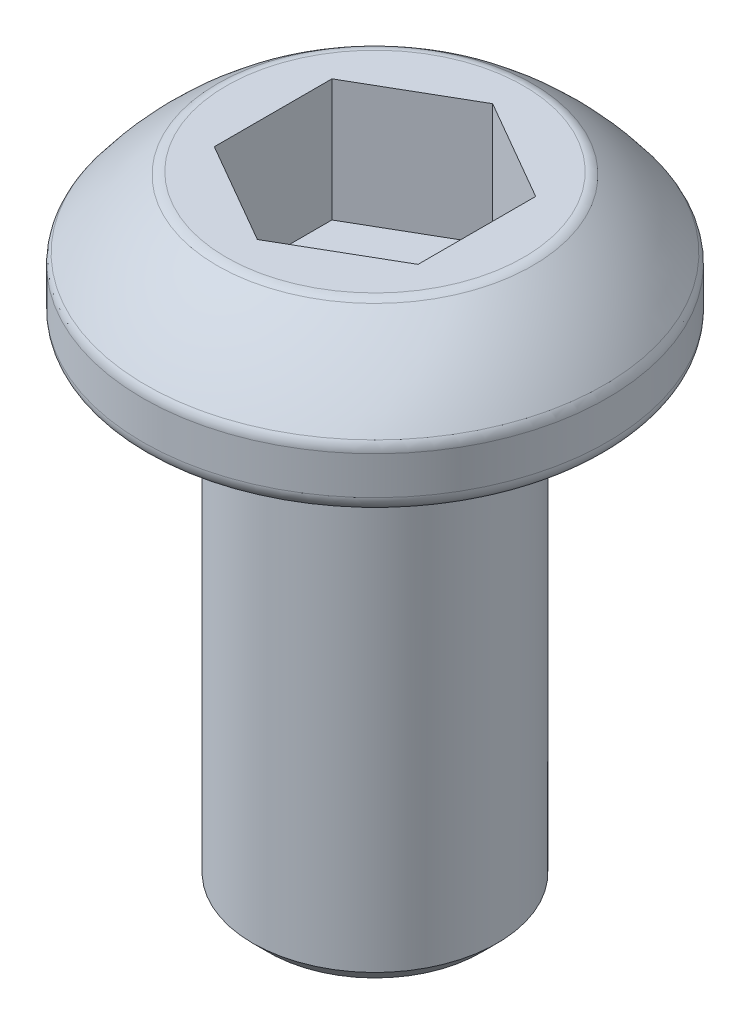
ISO-10303-21;
HEADER;
FILE_DESCRIPTION(('STEP AP214'),'2;1');
FILE_NAME('part.step','',(''),(''),'','','');
FILE_SCHEMA(('AUTOMOTIVE_DESIGN { 1 0 10303 214 1 1 1 1 }'));
ENDSEC;
DATA;
#1=APPLICATION_CONTEXT('core data for automotive mechanical design processes');
#2=APPLICATION_PROTOCOL_DEFINITION('international standard','automotive_design',2000,#1);
#3=PRODUCT_CONTEXT('',#1,'mechanical');
#4=PRODUCT('Part','Part','',(#3));
#5=PRODUCT_RELATED_PRODUCT_CATEGORY('part','',(#4));
#6=PRODUCT_DEFINITION_FORMATION('','',#4);
#7=PRODUCT_DEFINITION_CONTEXT('part definition',#1,'design');
#8=PRODUCT_DEFINITION('design','',#6,#7);
#9=PRODUCT_DEFINITION_SHAPE('','',#8);
#10=(LENGTH_UNIT() NAMED_UNIT(*) SI_UNIT(.MILLI.,.METRE.));
#11=(NAMED_UNIT(*) PLANE_ANGLE_UNIT() SI_UNIT($,.RADIAN.));
#12=(NAMED_UNIT(*) SI_UNIT($,.STERADIAN.) SOLID_ANGLE_UNIT());
#13=UNCERTAINTY_MEASURE_WITH_UNIT(LENGTH_MEASURE(1.E-05),#10,'distance_accuracy_value','');
#14=(GEOMETRIC_REPRESENTATION_CONTEXT(3) GLOBAL_UNCERTAINTY_ASSIGNED_CONTEXT((#13)) GLOBAL_UNIT_ASSIGNED_CONTEXT((#10,
#11,#12)) REPRESENTATION_CONTEXT('',''));
#15=CARTESIAN_POINT('',(0.,0.,0.));
#16=DIRECTION('',(0.,0.,1.));
#17=DIRECTION('',(1.,0.,0.));
#18=AXIS2_PLACEMENT_3D('',#15,#16,#17);
#19=CARTESIAN_POINT('',(0.,60.1595545799248,0.));
#20=DIRECTION('',(0.,1.,0.));
#21=DIRECTION('',(0.,0.,1.));
#22=AXIS2_PLACEMENT_3D('',#19,#20,#21);
#23=CYLINDRICAL_SURFACE('',#22,2.85);
#24=CARTESIAN_POINT('',(0.,0.666596043929719,0.));
#25=DIRECTION('',(0.,-1.,0.));
#26=DIRECTION('',(0.,0.,-1.));
#27=AXIS2_PLACEMENT_3D('',#24,#25,#26);
#28=CIRCLE('',#27,2.85);
#29=CARTESIAN_POINT('',(0.,0.666596043929719,-2.85));
#30=VERTEX_POINT('',#29);
#31=EDGE_CURVE('E11',#30,#30,#28,.T.);
#32=ORIENTED_EDGE('',*,*,#31,.T.);
#33=EDGE_LOOP('',(#32));
#34=FACE_BOUND('',#33,.T.);
#35=CARTESIAN_POINT('',(0.,0.2,0.));
#36=DIRECTION('',(0.,-1.,0.));
#37=DIRECTION('',(0.,0.,-1.));
#38=AXIS2_PLACEMENT_3D('',#35,#36,#37);
#39=CIRCLE('',#38,2.85);
#40=CARTESIAN_POINT('',(0.,0.2,-2.85));
#41=VERTEX_POINT('',#40);
#42=EDGE_CURVE('E127',#41,#41,#39,.F.);
#43=ORIENTED_EDGE('',*,*,#42,.T.);
#44=EDGE_LOOP('',(#43));
#45=FACE_BOUND('',#44,.T.);
#46=ADVANCED_FACE('F17',(#34,#45),#23,.T.);
#47=CARTESIAN_POINT('',(-1.5,0.,0.));
#48=DIRECTION('',(0.,-1.,0.));
#49=DIRECTION('',(0.,0.,-1.));
#50=AXIS2_PLACEMENT_3D('',#47,#48,#49);
#51=PLANE('',#50);
#52=CARTESIAN_POINT('',(0.,0.,0.));
#53=DIRECTION('',(0.,-1.,0.));
#54=DIRECTION('',(0.,0.,-1.));
#55=AXIS2_PLACEMENT_3D('',#52,#53,#54);
#56=CIRCLE('',#55,2.65);
#57=CARTESIAN_POINT('',(0.,0.,-2.65));
#58=VERTEX_POINT('',#57);
#59=EDGE_CURVE('E130',#58,#58,#56,.T.);
#60=ORIENTED_EDGE('',*,*,#59,.T.);
#61=EDGE_LOOP('',(#60));
#62=FACE_BOUND('',#61,.T.);
#63=CARTESIAN_POINT('',(0.,0.,0.));
#64=DIRECTION('',(0.,1.,0.));
#65=DIRECTION('',(0.,0.,1.));
#66=AXIS2_PLACEMENT_3D('',#63,#64,#65);
#67=CIRCLE('',#66,1.5);
#68=CARTESIAN_POINT('',(0.,0.,1.5));
#69=VERTEX_POINT('',#68);
#70=EDGE_CURVE('E119',#69,#69,#67,.T.);
#71=ORIENTED_EDGE('',*,*,#70,.T.);
#72=EDGE_LOOP('',(#71));
#73=FACE_BOUND('',#72,.T.);
#74=ADVANCED_FACE('F170',(#62,#73),#51,.T.);
#75=CARTESIAN_POINT('',(0.,60.1595545799248,0.));
#76=DIRECTION('',(0.,1.,0.));
#77=DIRECTION('',(0.,0.,1.));
#78=AXIS2_PLACEMENT_3D('',#75,#76,#77);
#79=CYLINDRICAL_SURFACE('',#78,1.5);
#80=CARTESIAN_POINT('',(0.,-5.8,0.));
#81=DIRECTION('',(0.,-1.,0.));
#82=DIRECTION('',(0.,0.,-1.));
#83=AXIS2_PLACEMENT_3D('',#80,#81,#82);
#84=CIRCLE('',#83,1.5);
#85=CARTESIAN_POINT('',(0.,-5.8,-1.5));
#86=VERTEX_POINT('',#85);
#87=EDGE_CURVE('E133',#86,#86,#84,.F.);
#88=ORIENTED_EDGE('',*,*,#87,.T.);
#89=EDGE_LOOP('',(#88));
#90=FACE_BOUND('',#89,.T.);
#91=ORIENTED_EDGE('',*,*,#70,.F.);
#92=EDGE_LOOP('',(#91));
#93=FACE_BOUND('',#92,.T.);
#94=ADVANCED_FACE('F177',(#90,#93),#79,.T.);
#95=CARTESIAN_POINT('',(0.,-6.,0.));
#96=DIRECTION('',(0.,-1.,0.));
#97=DIRECTION('',(0.,0.,-1.));
#98=AXIS2_PLACEMENT_3D('',#95,#96,#97);
#99=PLANE('',#98);
#100=CARTESIAN_POINT('',(0.,-6.,0.));
#101=DIRECTION('',(0.,-1.,0.));
#102=DIRECTION('',(0.,0.,-1.));
#103=AXIS2_PLACEMENT_3D('',#100,#101,#102);
#104=CIRCLE('',#103,1.3);
#105=CARTESIAN_POINT('',(0.,-6.,-1.3));
#106=VERTEX_POINT('',#105);
#107=EDGE_CURVE('E136',#106,#106,#104,.T.);
#108=ORIENTED_EDGE('',*,*,#107,.T.);
#109=EDGE_LOOP('',(#108));
#110=FACE_BOUND('',#109,.T.);
#111=ADVANCED_FACE('F189',(#110),#99,.T.);
#112=CARTESIAN_POINT('',(0.,0.2,0.));
#113=DIRECTION('',(0.,-1.,0.));
#114=DIRECTION('',(0.,0.,-1.));
#115=AXIS2_PLACEMENT_3D('',#112,#113,#114);
#116=TOROIDAL_SURFACE('',#115,2.65,0.2);
#117=ORIENTED_EDGE('',*,*,#59,.F.);
#118=EDGE_LOOP('',(#117));
#119=FACE_BOUND('',#118,.T.);
#120=ORIENTED_EDGE('',*,*,#42,.F.);
#121=EDGE_LOOP('',(#120));
#122=FACE_BOUND('',#121,.T.);
#123=ADVANCED_FACE('F186',(#119,#122),#116,.T.);
#124=CARTESIAN_POINT('',(0.,-5.8,0.));
#125=DIRECTION('',(0.,1.,0.));
#126=DIRECTION('',(0.,0.,1.));
#127=AXIS2_PLACEMENT_3D('',#124,#125,#126);
#128=CONICAL_SURFACE('',#127,1.5,0.785398163397432);
#129=ORIENTED_EDGE('',*,*,#107,.F.);
#130=EDGE_LOOP('',(#129));
#131=FACE_BOUND('',#130,.T.);
#132=ORIENTED_EDGE('',*,*,#87,.F.);
#133=EDGE_LOOP('',(#132));
#134=FACE_BOUND('',#133,.T.);
#135=ADVANCED_FACE('F158',(#131,#134),#128,.T.);
#136=CARTESIAN_POINT('',(0.,-1.3,0.));
#137=DIRECTION('',(0.,1.,0.));
#138=DIRECTION('',(-1.,0.,0.));
#139=AXIS2_PLACEMENT_3D('',#136,#137,#138);
#140=SPHERICAL_SURFACE('',#139,3.5);
#141=CARTESIAN_POINT('',(0.,1.61666666666667,0.));
#142=DIRECTION('',(0.,-1.,0.));
#143=DIRECTION('',(0.,0.,-1.));
#144=AXIS2_PLACEMENT_3D('',#141,#142,#143);
#145=CIRCLE('',#144,1.93469779437398);
#146=CARTESIAN_POINT('',(-1.93469779437399,1.61666666666667,0.));
#147=VERTEX_POINT('',#146);
#148=EDGE_CURVE('E142',#147,#147,#145,.T.);
#149=CARTESIAN_POINT('',(0.,0.785783682955765,0.));
#150=DIRECTION('',(0.,-1.,0.));
#151=DIRECTION('',(0.,0.,-1.));
#152=AXIS2_PLACEMENT_3D('',#149,#150,#151);
#153=CIRCLE('',#152,2.81060606060606);
#154=CARTESIAN_POINT('',(-2.81060606060605,0.785783682955765,0.));
#155=VERTEX_POINT('',#154);
#156=EDGE_CURVE('E139',#155,#155,#153,.F.);
#157=CARTESIAN_POINT('',(-1.93469779437399,1.61666666666667,0.));
#158=CARTESIAN_POINT('',(-1.94523052712988,1.60968004561565,0.));
#159=CARTESIAN_POINT('',(-1.9557254113343,1.60263636582437,0.));
#160=CARTESIAN_POINT('',(-1.97663825800548,1.58843572594383,0.));
#161=CARTESIAN_POINT('',(-1.98705622047225,1.58127876585458,0.));
#162=CARTESIAN_POINT('',(-2.00781399903341,1.56685240256066,0.));
#163=CARTESIAN_POINT('',(-2.0181538151278,1.559582999356,0.));
#164=CARTESIAN_POINT('',(-2.0387540879004,1.54493260377344,0.));
#165=CARTESIAN_POINT('',(-2.0490145445786,1.53755161139555,0.));
#166=CARTESIAN_POINT('',(-2.06945489414099,1.52267890355106,0.));
#167=CARTESIAN_POINT('',(-2.07963478702517,1.51518718808446,0.));
#168=CARTESIAN_POINT('',(-2.09991281425093,1.5000939133981,0.));
#169=CARTESIAN_POINT('',(-2.11001094859251,1.49249235417834,0.));
#170=CARTESIAN_POINT('',(-2.13012427353369,1.47718028414474,0.));
#171=CARTESIAN_POINT('',(-2.14013946413329,1.4694697733309,0.));
#172=CARTESIAN_POINT('',(-2.1600857261385,1.4539407050739,0.));
#173=CARTESIAN_POINT('',(-2.17001679754411,1.44612214763075,0.));
#174=CARTESIAN_POINT('',(-2.1897936555788,1.43037790375611,0.));
#175=CARTESIAN_POINT('',(-2.19963944220789,1.42245221732462,0.));
#176=CARTESIAN_POINT('',(-2.21924457511753,1.40649464568905,0.));
#177=CARTESIAN_POINT('',(-2.22900392139809,1.39846276048496,0.));
#178=CARTESIAN_POINT('',(-2.24843502818371,1.3822937339838,0.));
#179=CARTESIAN_POINT('',(-2.25810678868877,1.37415659268674,0.));
#180=CARTESIAN_POINT('',(-2.27736158877615,1.35777800903296,0.));
#181=CARTESIAN_POINT('',(-2.28694462835848,1.34953656667624,0.));
#182=CARTESIAN_POINT('',(-2.3060208618661,1.33295034817798,0.));
#183=CARTESIAN_POINT('',(-2.31551405579139,1.32460557203644,0.));
#184=CARTESIAN_POINT('',(-2.33440948379555,1.30781366537136,0.));
#185=CARTESIAN_POINT('',(-2.34381171787442,1.29936653484782,0.));
#186=CARTESIAN_POINT('',(-2.36252412267206,1.28237091083462,0.));
#187=CARTESIAN_POINT('',(-2.37183429339084,1.27382241734495,0.));
#188=CARTESIAN_POINT('',(-2.39036147875982,1.25662507071205,0.));
#189=CARTESIAN_POINT('',(-2.39957849341004,1.24797621756881,0.));
#190=CARTESIAN_POINT('',(-2.41791828486691,1.23057916672024,0.));
#191=CARTESIAN_POINT('',(-2.42704106167356,1.22183096901491,0.));
#192=CARTESIAN_POINT('',(-2.44519130672875,1.20423625579344,0.));
#193=CARTESIAN_POINT('',(-2.45421877497729,1.1953897402773,0.));
#194=CARTESIAN_POINT('',(-2.47217734338775,1.17759942972477,0.));
#195=CARTESIAN_POINT('',(-2.48110844354969,1.16865563468837,0.));
#196=CARTESIAN_POINT('',(-2.49887322756895,1.15067181480331,0.));
#197=CARTESIAN_POINT('',(-2.50770691142627,1.14163178995465,0.));
#198=CARTESIAN_POINT('',(-2.52527582605175,1.12345657144725,0.));
#199=CARTESIAN_POINT('',(-2.53401105681991,1.11432137778852,0.));
#200=CARTESIAN_POINT('',(-2.55138204003769,1.09595689383288,0.));
#201=CARTESIAN_POINT('',(-2.56001779248732,1.08672760353599,0.));
#202=CARTESIAN_POINT('',(-2.57718880551411,1.06817600951976,0.));
#203=CARTESIAN_POINT('',(-2.58572406609128,1.05885370580044,0.));
#204=CARTESIAN_POINT('',(-2.6026930936138,1.0401171790719,0.));
#205=CARTESIAN_POINT('',(-2.61112686055914,1.03070295606268,0.));
#206=CARTESIAN_POINT('',(-2.62789191097032,1.01178369567493,0.));
#207=CARTESIAN_POINT('',(-2.63622319443615,1.00227865829641,0.));
#208=CARTESIAN_POINT('',(-2.65278230007006,0.983178884750212,0.));
#209=CARTESIAN_POINT('',(-2.66101012223815,0.973584148582545,0.));
#210=CARTESIAN_POINT('',(-2.67736133959657,0.954306103562343,0.));
#211=CARTESIAN_POINT('',(-2.6854847347869,0.944622794709807,0.));
#212=CARTESIAN_POINT('',(-2.70162614478381,0.925168740833083,0.));
#213=CARTESIAN_POINT('',(-2.70964415959037,0.915397995808895,0.));
#214=CARTESIAN_POINT('',(-2.72557386771592,0.895770216314132,0.));
#215=CARTESIAN_POINT('',(-2.73348556103491,0.885913181843557,0.));
#216=CARTESIAN_POINT('',(-2.7492016978064,0.866113980495762,0.));
#217=CARTESIAN_POINT('',(-2.7570061412589,0.856171813618541,0.));
#218=CARTESIAN_POINT('',(-2.7725068615871,0.836203513791331,0.));
#219=CARTESIAN_POINT('',(-2.78020313846278,0.826177380841341,0.));
#220=CARTESIAN_POINT('',(-2.79548662505218,0.806042327660861,0.));
#221=CARTESIAN_POINT('',(-2.8030738347659,0.795933407430371,0.));
#222=CARTESIAN_POINT('',(-2.81060606060605,0.785783682955765,0.));
#223=B_SPLINE_CURVE_WITH_KNOTS('',3,(#157,#158,#159,#160,#161,#162,#163,#164,#165,#166,#167,
#168,#169,#170,#171,#172,#173,#174,#175,#176,#177,#178,#179,#180,#181,#182,#183,#184,#185,#186,
#187,#188,#189,#190,#191,#192,#193,#194,#195,#196,#197,#198,#199,#200,#201,#202,#203,#204,#205,
#206,#207,#208,#209,#210,#211,#212,#213,#214,#215,#216,#217,#218,#219,#220,#221,#222),
.UNSPECIFIED.,.F.,.F.,(4,2,2,2,2,2,2,2,2,2,2,2,2,2,2,2,2,2,2,2,2,2,2,2,2,2,2,2,2,2,2,2,4),(0.,
0.0379176466570755,0.0758352933141507,0.113752939971226,0.151670586628302,0.189588233285377,
0.227505879942452,0.265423526599527,0.303341173256603,0.341258819913678,0.379176466570754,
0.417094113227829,0.455011759884904,0.49292940654198,0.530847053199055,0.568764699856131,
0.606682346513206,0.644599993170282,0.682517639827357,0.720435286484432,0.758352933141508,
0.796270579798584,0.834188226455659,0.872105873112734,0.910023519769809,0.947941166426885,
0.985858813083961,1.02377645974104,1.06169410639811,1.09961175305519,1.13752939971226,
1.17544704636934,1.21336469302641),.UNSPECIFIED.);
#224=EDGE_CURVE('BSEAM155',#147,#155,#223,.T.);
#225=ORIENTED_EDGE('',*,*,#148,.T.);
#226=ORIENTED_EDGE('',*,*,#156,.T.);
#227=ORIENTED_EDGE('',*,*,#224,.T.);
#228=ORIENTED_EDGE('',*,*,#224,.F.);
#229=EDGE_LOOP('',(#225,#227,#226,#228));
#230=FACE_BOUND('',#229,.T.);
#231=ADVANCED_FACE('F155',(#230),#140,.T.);
#232=CARTESIAN_POINT('',(0.,0.15,0.));
#233=DIRECTION('',(0.,1.,0.));
#234=DIRECTION('',(0.,0.,1.));
#235=AXIS2_PLACEMENT_3D('',#232,#233,#234);
#236=PLANE('',#235);
#237=DIRECTION('',(-0.866025403784439,0.,0.5));
#238=VECTOR('',#237,1.);
#239=CARTESIAN_POINT('',(0.,0.15,-1.44337567297406));
#240=LINE('',#239,#238);
#241=CARTESIAN_POINT('',(0.,0.15,-1.44337567297406));
#242=VERTEX_POINT('',#241);
#243=CARTESIAN_POINT('',(-1.25,0.15,-0.721687836487032));
#244=VERTEX_POINT('',#243);
#245=EDGE_CURVE('E117',#242,#244,#240,.T.);
#246=ORIENTED_EDGE('',*,*,#245,.T.);
#247=DIRECTION('',(0.,0.,1.));
#248=VECTOR('',#247,1.);
#249=CARTESIAN_POINT('',(-1.25,0.15,-0.721687836487032));
#250=LINE('',#249,#248);
#251=CARTESIAN_POINT('',(-1.25,0.15,0.721687836487032));
#252=VERTEX_POINT('',#251);
#253=EDGE_CURVE('E100',#244,#252,#250,.T.);
#254=ORIENTED_EDGE('',*,*,#253,.T.);
#255=DIRECTION('',(0.866025403784439,0.,0.5));
#256=VECTOR('',#255,1.);
#257=CARTESIAN_POINT('',(-1.25,0.15,0.721687836487032));
#258=LINE('',#257,#256);
#259=CARTESIAN_POINT('',(0.,0.15,1.44337567297406));
#260=VERTEX_POINT('',#259);
#261=EDGE_CURVE('E98',#252,#260,#258,.T.);
#262=ORIENTED_EDGE('',*,*,#261,.T.);
#263=DIRECTION('',(0.866025403784439,0.,-0.5));
#264=VECTOR('',#263,1.);
#265=CARTESIAN_POINT('',(0.,0.15,1.44337567297406));
#266=LINE('',#265,#264);
#267=CARTESIAN_POINT('',(1.25,0.15,0.721687836487032));
#268=VERTEX_POINT('',#267);
#269=EDGE_CURVE('E77',#260,#268,#266,.T.);
#270=ORIENTED_EDGE('',*,*,#269,.T.);
#271=DIRECTION('',(0.,0.,-1.));
#272=VECTOR('',#271,1.);
#273=CARTESIAN_POINT('',(1.25,0.15,0.721687836487032));
#274=LINE('',#273,#272);
#275=CARTESIAN_POINT('',(1.25,0.15,-0.721687836487032));
#276=VERTEX_POINT('',#275);
#277=EDGE_CURVE('E88',#268,#276,#274,.T.);
#278=ORIENTED_EDGE('',*,*,#277,.T.);
#279=DIRECTION('',(-0.866025403784439,0.,-0.5));
#280=VECTOR('',#279,1.);
#281=CARTESIAN_POINT('',(1.25,0.15,-0.721687836487032));
#282=LINE('',#281,#280);
#283=EDGE_CURVE('E92',#276,#242,#282,.T.);
#284=ORIENTED_EDGE('',*,*,#283,.T.);
#285=EDGE_LOOP('',(#246,#254,#262,#270,#278,#284));
#286=FACE_BOUND('',#285,.T.);
#287=ADVANCED_FACE('F95',(#286),#236,.T.);
#288=CARTESIAN_POINT('',(-1.25,0.15,-0.721687836487032));
#289=DIRECTION('',(-1.,0.,0.));
#290=DIRECTION('',(0.,0.,1.));
#291=AXIS2_PLACEMENT_3D('',#288,#289,#290);
#292=PLANE('',#291);
#293=DIRECTION('',(0.,0.,1.));
#294=VECTOR('',#293,1.);
#295=CARTESIAN_POINT('',(-1.25,1.65,-0.721687836487032));
#296=LINE('',#295,#294);
#297=CARTESIAN_POINT('',(-1.25,1.65,-0.721687836487032));
#298=VERTEX_POINT('',#297);
#299=CARTESIAN_POINT('',(-1.25,1.65,0.721687836487032));
#300=VERTEX_POINT('',#299);
#301=EDGE_CURVE('E106',#298,#300,#296,.T.);
#302=ORIENTED_EDGE('',*,*,#301,.T.);
#303=DIRECTION('',(0.,1.,0.));
#304=VECTOR('',#303,1.);
#305=CARTESIAN_POINT('',(-1.25,0.15,0.721687836487032));
#306=LINE('',#305,#304);
#307=EDGE_CURVE('E122',#252,#300,#306,.T.);
#308=ORIENTED_EDGE('',*,*,#307,.F.);
#309=ORIENTED_EDGE('',*,*,#253,.F.);
#310=DIRECTION('',(0.,1.,0.));
#311=VECTOR('',#310,1.);
#312=CARTESIAN_POINT('',(-1.25,0.15,-0.721687836487032));
#313=LINE('',#312,#311);
#314=EDGE_CURVE('E62',#244,#298,#313,.T.);
#315=ORIENTED_EDGE('',*,*,#314,.T.);
#316=EDGE_LOOP('',(#302,#308,#309,#315));
#317=FACE_BOUND('',#316,.T.);
#318=ADVANCED_FACE('F214',(#317),#292,.F.);
#319=CARTESIAN_POINT('',(-1.25,0.15,0.721687836487032));
#320=DIRECTION('',(-0.5,0.,0.866025403784439));
#321=DIRECTION('',(0.866025403784439,0.,0.5));
#322=AXIS2_PLACEMENT_3D('',#319,#320,#321);
#323=PLANE('',#322);
#324=DIRECTION('',(0.866025403784439,0.,0.5));
#325=VECTOR('',#324,1.);
#326=CARTESIAN_POINT('',(-1.25,1.65,0.721687836487032));
#327=LINE('',#326,#325);
#328=CARTESIAN_POINT('',(0.,1.65,1.44337567297406));
#329=VERTEX_POINT('',#328);
#330=EDGE_CURVE('E109',#300,#329,#327,.T.);
#331=ORIENTED_EDGE('',*,*,#330,.T.);
#332=DIRECTION('',(0.,1.,0.));
#333=VECTOR('',#332,1.);
#334=CARTESIAN_POINT('',(0.,0.15,1.44337567297406));
#335=LINE('',#334,#333);
#336=EDGE_CURVE('E85',#260,#329,#335,.T.);
#337=ORIENTED_EDGE('',*,*,#336,.F.);
#338=ORIENTED_EDGE('',*,*,#261,.F.);
#339=ORIENTED_EDGE('',*,*,#307,.T.);
#340=EDGE_LOOP('',(#331,#337,#338,#339));
#341=FACE_BOUND('',#340,.T.);
#342=ADVANCED_FACE('F217',(#341),#323,.F.);
#343=CARTESIAN_POINT('',(0.,0.15,1.44337567297406));
#344=DIRECTION('',(0.5,0.,0.866025403784438));
#345=DIRECTION('',(0.866025403784439,0.,-0.5));
#346=AXIS2_PLACEMENT_3D('',#343,#344,#345);
#347=PLANE('',#346);
#348=DIRECTION('',(0.866025403784439,0.,-0.5));
#349=VECTOR('',#348,1.);
#350=CARTESIAN_POINT('',(0.,1.65,1.44337567297406));
#351=LINE('',#350,#349);
#352=CARTESIAN_POINT('',(1.25,1.65,0.721687836487032));
#353=VERTEX_POINT('',#352);
#354=EDGE_CURVE('E80',#329,#353,#351,.T.);
#355=ORIENTED_EDGE('',*,*,#354,.T.);
#356=DIRECTION('',(0.,1.,0.));
#357=VECTOR('',#356,1.);
#358=CARTESIAN_POINT('',(1.25,0.15,0.721687836487032));
#359=LINE('',#358,#357);
#360=EDGE_CURVE('E73',#268,#353,#359,.T.);
#361=ORIENTED_EDGE('',*,*,#360,.F.);
#362=ORIENTED_EDGE('',*,*,#269,.F.);
#363=ORIENTED_EDGE('',*,*,#336,.T.);
#364=EDGE_LOOP('',(#355,#361,#362,#363));
#365=FACE_BOUND('',#364,.T.);
#366=ADVANCED_FACE('F75',(#365),#347,.F.);
#367=CARTESIAN_POINT('',(1.25,0.15,0.721687836487032));
#368=DIRECTION('',(1.,0.,0.));
#369=DIRECTION('',(0.,0.,-1.));
#370=AXIS2_PLACEMENT_3D('',#367,#368,#369);
#371=PLANE('',#370);
#372=DIRECTION('',(0.,0.,-1.));
#373=VECTOR('',#372,1.);
#374=CARTESIAN_POINT('',(1.25,1.65,0.721687836487032));
#375=LINE('',#374,#373);
#376=CARTESIAN_POINT('',(1.25,1.65,-0.721687836487032));
#377=VERTEX_POINT('',#376);
#378=EDGE_CURVE('E113',#353,#377,#375,.T.);
#379=ORIENTED_EDGE('',*,*,#378,.T.);
#380=DIRECTION('',(0.,1.,0.));
#381=VECTOR('',#380,1.);
#382=CARTESIAN_POINT('',(1.25,0.15,-0.721687836487032));
#383=LINE('',#382,#381);
#384=EDGE_CURVE('E84',#276,#377,#383,.T.);
#385=ORIENTED_EDGE('',*,*,#384,.F.);
#386=ORIENTED_EDGE('',*,*,#277,.F.);
#387=ORIENTED_EDGE('',*,*,#360,.T.);
#388=EDGE_LOOP('',(#379,#385,#386,#387));
#389=FACE_BOUND('',#388,.T.);
#390=ADVANCED_FACE('F89',(#389),#371,.F.);
#391=CARTESIAN_POINT('',(1.25,0.15,-0.721687836487032));
#392=DIRECTION('',(0.5,0.,-0.866025403784439));
#393=DIRECTION('',(-0.866025403784439,0.,-0.5));
#394=AXIS2_PLACEMENT_3D('',#391,#392,#393);
#395=PLANE('',#394);
#396=DIRECTION('',(-0.866025403784439,0.,-0.5));
#397=VECTOR('',#396,1.);
#398=CARTESIAN_POINT('',(1.25,1.65,-0.721687836487032));
#399=LINE('',#398,#397);
#400=CARTESIAN_POINT('',(0.,1.65,-1.44337567297406));
#401=VERTEX_POINT('',#400);
#402=EDGE_CURVE('E115',#377,#401,#399,.T.);
#403=ORIENTED_EDGE('',*,*,#402,.T.);
#404=DIRECTION('',(0.,1.,0.));
#405=VECTOR('',#404,1.);
#406=CARTESIAN_POINT('',(0.,0.15,-1.44337567297406));
#407=LINE('',#406,#405);
#408=EDGE_CURVE('E40',#242,#401,#407,.T.);
#409=ORIENTED_EDGE('',*,*,#408,.F.);
#410=ORIENTED_EDGE('',*,*,#283,.F.);
#411=ORIENTED_EDGE('',*,*,#384,.T.);
#412=EDGE_LOOP('',(#403,#409,#410,#411));
#413=FACE_BOUND('',#412,.T.);
#414=ADVANCED_FACE('F213',(#413),#395,.F.);
#415=CARTESIAN_POINT('',(0.,0.15,-1.44337567297406));
#416=DIRECTION('',(-0.5,0.,-0.866025403784439));
#417=DIRECTION('',(-0.866025403784439,0.,0.5));
#418=AXIS2_PLACEMENT_3D('',#415,#416,#417);
#419=PLANE('',#418);
#420=DIRECTION('',(-0.866025403784439,0.,0.5));
#421=VECTOR('',#420,1.);
#422=CARTESIAN_POINT('',(0.,1.65,-1.44337567297406));
#423=LINE('',#422,#421);
#424=EDGE_CURVE('E32',#401,#298,#423,.T.);
#425=ORIENTED_EDGE('',*,*,#424,.T.);
#426=ORIENTED_EDGE('',*,*,#314,.F.);
#427=ORIENTED_EDGE('',*,*,#245,.F.);
#428=ORIENTED_EDGE('',*,*,#408,.T.);
#429=EDGE_LOOP('',(#425,#426,#427,#428));
#430=FACE_BOUND('',#429,.T.);
#431=ADVANCED_FACE('F185',(#430),#419,.F.);
#432=CARTESIAN_POINT('',(0.,1.65,0.));
#433=DIRECTION('',(0.,1.,0.));
#434=DIRECTION('',(0.,0.,1.));
#435=AXIS2_PLACEMENT_3D('',#432,#433,#434);
#436=PLANE('',#435);
#437=CARTESIAN_POINT('',(0.,1.65,0.));
#438=DIRECTION('',(0.,1.,0.));
#439=DIRECTION('',(0.,0.,1.));
#440=AXIS2_PLACEMENT_3D('',#437,#438,#439);
#441=CIRCLE('',#440,1.82414363469547);
#442=CARTESIAN_POINT('',(0.,1.65,1.82414363469547));
#443=VERTEX_POINT('',#442);
#444=EDGE_CURVE('E25',#443,#443,#441,.T.);
#445=ORIENTED_EDGE('',*,*,#444,.T.);
#446=EDGE_LOOP('',(#445));
#447=FACE_BOUND('',#446,.T.);
#448=ORIENTED_EDGE('',*,*,#424,.F.);
#449=ORIENTED_EDGE('',*,*,#402,.F.);
#450=ORIENTED_EDGE('',*,*,#378,.F.);
#451=ORIENTED_EDGE('',*,*,#354,.F.);
#452=ORIENTED_EDGE('',*,*,#330,.F.);
#453=ORIENTED_EDGE('',*,*,#301,.F.);
#454=EDGE_LOOP('',(#448,#449,#450,#451,#452,#453));
#455=FACE_BOUND('',#454,.T.);
#456=ADVANCED_FACE('F147',(#447,#455),#436,.T.);
#457=CARTESIAN_POINT('',(0.,1.45,0.));
#458=DIRECTION('',(0.,1.,0.));
#459=DIRECTION('',(0.,0.,1.));
#460=AXIS2_PLACEMENT_3D('',#457,#458,#459);
#461=TOROIDAL_SURFACE('',#460,1.82414363469547,0.2);
#462=ORIENTED_EDGE('',*,*,#444,.F.);
#463=EDGE_LOOP('',(#462));
#464=FACE_BOUND('',#463,.T.);
#465=ORIENTED_EDGE('',*,*,#148,.F.);
#466=EDGE_LOOP('',(#465));
#467=FACE_BOUND('',#466,.T.);
#468=ADVANCED_FACE('F150',(#464,#467),#461,.T.);
#469=CARTESIAN_POINT('',(0.,0.666596043929721,0.));
#470=DIRECTION('',(0.,-1.,0.));
#471=DIRECTION('',(0.,0.,-1.));
#472=AXIS2_PLACEMENT_3D('',#469,#470,#471);
#473=TOROIDAL_SURFACE('',#472,2.65,0.2);
#474=ORIENTED_EDGE('',*,*,#31,.F.);
#475=EDGE_LOOP('',(#474));
#476=FACE_BOUND('',#475,.T.);
#477=ORIENTED_EDGE('',*,*,#156,.F.);
#478=EDGE_LOOP('',(#477));
#479=FACE_BOUND('',#478,.T.);
#480=ADVANCED_FACE('F19',(#476,#479),#473,.T.);
#481=CLOSED_SHELL('',(#46,#74,#94,#111,#123,#135,#231,#287,#318,#342,#366,#390,#414,#431,#456,
#468,#480));
#482=MANIFOLD_SOLID_BREP('B1',#481);
#483=ADVANCED_BREP_SHAPE_REPRESENTATION('',(#18,#482),#14);
#484=SHAPE_DEFINITION_REPRESENTATION(#9,#483);
ENDSEC;
END-ISO-10303-21;
